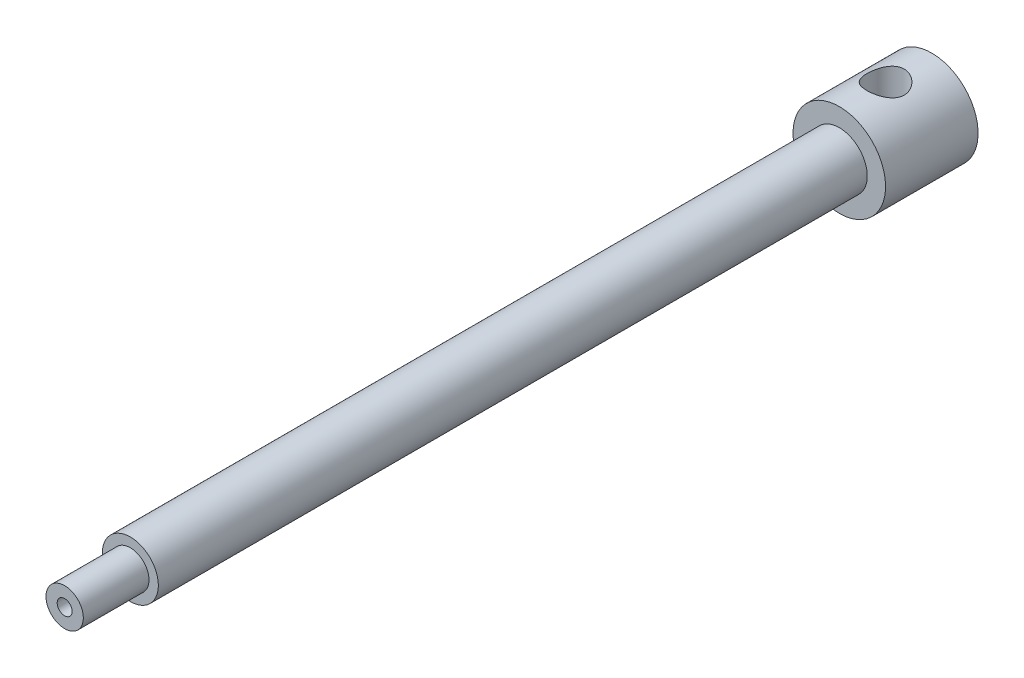
ISO-10303-21;
HEADER;
FILE_DESCRIPTION(('STEP AP214'),'2;1');
FILE_NAME('part.step','',(''),(''),'','','');
FILE_SCHEMA(('AUTOMOTIVE_DESIGN { 1 0 10303 214 1 1 1 1 }'));
ENDSEC;
DATA;
#1=APPLICATION_CONTEXT('core data for automotive mechanical design processes');
#2=APPLICATION_PROTOCOL_DEFINITION('international standard','automotive_design',2000,#1);
#3=PRODUCT_CONTEXT('',#1,'mechanical');
#4=PRODUCT('Part','Part','',(#3));
#5=PRODUCT_RELATED_PRODUCT_CATEGORY('part','',(#4));
#6=PRODUCT_DEFINITION_FORMATION('','',#4);
#7=PRODUCT_DEFINITION_CONTEXT('part definition',#1,'design');
#8=PRODUCT_DEFINITION('design','',#6,#7);
#9=PRODUCT_DEFINITION_SHAPE('','',#8);
#10=(LENGTH_UNIT() NAMED_UNIT(*) SI_UNIT(.MILLI.,.METRE.));
#11=(NAMED_UNIT(*) PLANE_ANGLE_UNIT() SI_UNIT($,.RADIAN.));
#12=(NAMED_UNIT(*) SI_UNIT($,.STERADIAN.) SOLID_ANGLE_UNIT());
#13=UNCERTAINTY_MEASURE_WITH_UNIT(LENGTH_MEASURE(1.E-05),#10,'distance_accuracy_value','');
#14=(GEOMETRIC_REPRESENTATION_CONTEXT(3) GLOBAL_UNCERTAINTY_ASSIGNED_CONTEXT((#13)) GLOBAL_UNIT_ASSIGNED_CONTEXT((#10,
#11,#12)) REPRESENTATION_CONTEXT('',''));
#15=CARTESIAN_POINT('',(0.,0.,0.));
#16=DIRECTION('',(0.,0.,1.));
#17=DIRECTION('',(1.,0.,0.));
#18=AXIS2_PLACEMENT_3D('',#15,#16,#17);
#19=CARTESIAN_POINT('',(0.,0.,-81.2702478184991));
#20=DIRECTION('',(0.,0.,-1.));
#21=DIRECTION('',(-1.,0.,0.));
#22=AXIS2_PLACEMENT_3D('',#19,#20,#21);
#23=PLANE('',#22);
#24=CARTESIAN_POINT('',(0.,0.,-81.2702478184991));
#25=DIRECTION('',(0.,0.,-1.));
#26=DIRECTION('',(-1.,0.,0.));
#27=AXIS2_PLACEMENT_3D('',#24,#25,#26);
#28=CIRCLE('',#27,7.874);
#29=CARTESIAN_POINT('',(-7.874,0.,-81.2702478184991));
#30=VERTEX_POINT('',#29);
#31=EDGE_CURVE('E46',#30,#30,#28,.T.);
#32=ORIENTED_EDGE('',*,*,#31,.T.);
#33=EDGE_LOOP('',(#32));
#34=FACE_BOUND('',#33,.T.);
#35=ADVANCED_FACE('F33',(#34),#23,.T.);
#36=CARTESIAN_POINT('',(0.,0.,-59.3109947643979));
#37=DIRECTION('',(0.,0.,-1.));
#38=DIRECTION('',(-1.,0.,0.));
#39=AXIS2_PLACEMENT_3D('',#36,#37,#38);
#40=CYLINDRICAL_SURFACE('',#39,7.874);
#41=CARTESIAN_POINT('',(0.,-7.874,-70.2212478184991));
#42=CARTESIAN_POINT('',(-0.0853138065275081,-7.87399881940996,-70.2212495287538));
#43=CARTESIAN_POINT('',(-0.170655569118883,-7.87260816109943,-70.2246933813816));
#44=CARTESIAN_POINT('',(-0.340713654830116,-7.8670870568026,-70.238426177336));
#45=CARTESIAN_POINT('',(-0.425429557306199,-7.86295491243566,-70.2487193639116));
#46=CARTESIAN_POINT('',(-0.678039818847449,-7.84656037982232,-70.289810548876));
#47=CARTESIAN_POINT('',(-0.844145904456292,-7.8303003155091,-70.3308198494403));
#48=CARTESIAN_POINT('',(-1.16597633099032,-7.78888379341851,-70.4382292266118));
#49=CARTESIAN_POINT('',(-1.32173292526666,-7.76375667937359,-70.504545612686));
#50=CARTESIAN_POINT('',(-1.61980477112045,-7.70708234066068,-70.6603523141924));
#51=CARTESIAN_POINT('',(-1.76212455210029,-7.67553729080246,-70.749834782256));
#52=CARTESIAN_POINT('',(-2.03623294066059,-7.60752595910327,-70.9539445050457));
#53=CARTESIAN_POINT('',(-2.16729406416504,-7.57090528781625,-71.0694962904209));
#54=CARTESIAN_POINT('',(-2.40879713559216,-7.49756820349839,-71.3205126235591));
#55=CARTESIAN_POINT('',(-2.51922885234361,-7.46085175206969,-71.455986992733));
#56=CARTESIAN_POINT('',(-2.72127432337628,-7.38962484616999,-71.7504679452352));
#57=CARTESIAN_POINT('',(-2.81180642099635,-7.35529016554302,-71.9102635413601));
#58=CARTESIAN_POINT('',(-2.96438328075604,-7.29514110783972,-72.2444048519625));
#59=CARTESIAN_POINT('',(-3.02644179233511,-7.26932262012663,-72.4187434956674));
#60=CARTESIAN_POINT('',(-3.11735731028281,-7.23078908211499,-72.7686647558273));
#61=CARTESIAN_POINT('',(-3.14760766678057,-7.21752692150469,-72.9438228836375));
#62=CARTESIAN_POINT('',(-3.17839972786044,-7.20402411896809,-73.2971924925769));
#63=CARTESIAN_POINT('',(-3.17895636979412,-7.20377692989252,-73.4754023933838));
#64=CARTESIAN_POINT('',(-3.15139986911577,-7.21586598122804,-73.8163357493213));
#65=CARTESIAN_POINT('',(-3.12531734809012,-7.22731097779205,-73.979261115535));
#66=CARTESIAN_POINT('',(-3.04861261148163,-7.2599970139528,-74.298188681552));
#67=CARTESIAN_POINT('',(-2.99798603661225,-7.28123979370803,-74.4541896461329));
#68=CARTESIAN_POINT('',(-2.87266148125854,-7.33159711138427,-74.7586385133537));
#69=CARTESIAN_POINT('',(-2.7974894289216,-7.36086469262606,-74.9068648227467));
#70=CARTESIAN_POINT('',(-2.62554103256057,-7.42393306054218,-75.1891502451631));
#71=CARTESIAN_POINT('',(-2.52875649293859,-7.45773556494299,-75.3232039553541));
#72=CARTESIAN_POINT('',(-2.30738329559368,-7.52930314782267,-75.5844366951323));
#73=CARTESIAN_POINT('',(-2.18120631669873,-7.56717076283725,-75.7102453111648));
#74=CARTESIAN_POINT('',(-1.90914693107844,-7.6403442972344,-75.9393595803243));
#75=CARTESIAN_POINT('',(-1.76326048229995,-7.67564968886261,-76.042660606171));
#76=CARTESIAN_POINT('',(-1.4519834597174,-7.74063128710988,-76.2256654507216));
#77=CARTESIAN_POINT('',(-1.28625612038942,-7.770178177633,-76.3048457305642));
#78=CARTESIAN_POINT('',(-0.942339676136122,-7.81933319563992,-76.4337293559055));
#79=CARTESIAN_POINT('',(-0.764157061091356,-7.83894645580241,-76.4834479264482));
#80=CARTESIAN_POINT('',(-0.411868434997358,-7.86508441274245,-76.5492068260554));
#81=CARTESIAN_POINT('',(-0.238158955914311,-7.87232361132224,-76.5670883354528));
#82=CARTESIAN_POINT('',(0.109913125954057,-7.8751541874265,-76.5741121314587));
#83=CARTESIAN_POINT('',(0.284275543869659,-7.87074864475774,-76.5632620170193));
#84=CARTESIAN_POINT('',(0.620305944604803,-7.85125168274721,-76.5144777216207));
#85=CARTESIAN_POINT('',(0.782189526574389,-7.83665910845881,-76.4778072332827));
#86=CARTESIAN_POINT('',(1.09735153985033,-7.79877594743778,-76.3801500829902));
#87=CARTESIAN_POINT('',(1.2506288659423,-7.77548424648976,-76.3191603060661));
#88=CARTESIAN_POINT('',(1.54952526280039,-7.7215691192632,-76.1726039404382));
#89=CARTESIAN_POINT('',(1.69476474747819,-7.69074255592152,-76.0863403071919));
#90=CARTESIAN_POINT('',(1.9692191024373,-7.62508998345414,-75.892456744738));
#91=CARTESIAN_POINT('',(2.09842745965652,-7.59026235978888,-75.7848281813421));
#92=CARTESIAN_POINT('',(2.34624639570533,-7.51749887820835,-75.5428079942727));
#93=CARTESIAN_POINT('',(2.46356495844852,-7.47951121875179,-75.4071055294251));
#94=CARTESIAN_POINT('',(2.67409019313409,-7.40685850541485,-75.1172796482994));
#95=CARTESIAN_POINT('',(2.76729262031799,-7.37219403713503,-74.963152996091));
#96=CARTESIAN_POINT('',(2.92760488751249,-7.31002813647435,-74.6383719227938));
#97=CARTESIAN_POINT('',(2.99443010034691,-7.28260584447471,-74.4675607728362));
#98=CARTESIAN_POINT('',(3.09784166451536,-7.23923042543573,-74.1156679056194));
#99=CARTESIAN_POINT('',(3.1344508273425,-7.223268647511,-73.9345940467282));
#100=CARTESIAN_POINT('',(3.1741950512847,-7.20588570117556,-73.5815491315865));
#101=CARTESIAN_POINT('',(3.17957712065926,-7.20348878444623,-73.4098775828431));
#102=CARTESIAN_POINT('',(3.16263373946768,-7.21094375400632,-73.0681957130031));
#103=CARTESIAN_POINT('',(3.14031193750608,-7.22079402733906,-72.8981851761228));
#104=CARTESIAN_POINT('',(3.0704400285169,-7.25076670667075,-72.5717727484618));
#105=CARTESIAN_POINT('',(3.02395739930064,-7.27045320090325,-72.4150986413132));
#106=CARTESIAN_POINT('',(2.90808989717555,-7.31756650255749,-72.1117150053178));
#107=CARTESIAN_POINT('',(2.83869867713797,-7.34499545482417,-71.9650082516569));
#108=CARTESIAN_POINT('',(2.67435156286363,-7.40647236593437,-71.6764772647667));
#109=CARTESIAN_POINT('',(2.578149222479,-7.44081139200889,-71.5354261533528));
#110=CARTESIAN_POINT('',(2.36471003282482,-7.51136725763288,-71.2707626227931));
#111=CARTESIAN_POINT('',(2.24746665718648,-7.54758467732478,-71.1471556356607));
#112=CARTESIAN_POINT('',(1.9860512819155,-7.62070147481599,-70.9124810456077));
#113=CARTESIAN_POINT('',(1.84060885823373,-7.65748671307923,-70.8027892145443));
#114=CARTESIAN_POINT('',(1.53189158073066,-7.72515755582715,-70.6093030241123));
#115=CARTESIAN_POINT('',(1.36860852242477,-7.75604042785347,-70.5255206483019));
#116=CARTESIAN_POINT('',(1.11544104764093,-7.79505300718687,-70.4222662523901));
#117=CARTESIAN_POINT('',(1.03045664945645,-7.80676698725231,-70.391756836274));
#118=CARTESIAN_POINT('',(0.857919448827436,-7.82760347443312,-70.3380219405745));
#119=CARTESIAN_POINT('',(0.770367866333488,-7.83672719113316,-70.3147930606439));
#120=CARTESIAN_POINT('',(0.593592483724014,-7.85209418620097,-70.2759195916782));
#121=CARTESIAN_POINT('',(0.504373518171903,-7.85834475183656,-70.2602558098559));
#122=CARTESIAN_POINT('',(0.324807824619731,-7.86781060535872,-70.2366097304264));
#123=CARTESIAN_POINT('',(0.234461932692078,-7.87102802193401,-70.2286220455954));
#124=CARTESIAN_POINT('',(0.0959969096121474,-7.87356143505396,-70.2223356386442));
#125=CARTESIAN_POINT('',(0.0480028800985487,-7.87400066427375,-70.221246856203));
#126=CARTESIAN_POINT('',(0.,-7.874,-70.2212478184991));
#127=B_SPLINE_CURVE_WITH_KNOTS('',3,(#41,#42,#43,#44,#45,#46,#47,#48,#49,#50,#51,#52,#53,#54,
#55,#56,#57,#58,#59,#60,#61,#62,#63,#64,#65,#66,#67,#68,#69,#70,#71,#72,#73,#74,#75,#76,#77,#78,
#79,#80,#81,#82,#83,#84,#85,#86,#87,#88,#89,#90,#91,#92,#93,#94,#95,#96,#97,#98,#99,#100,#101,
#102,#103,#104,#105,#106,#107,#108,#109,#110,#111,#112,#113,#114,#115,#116,#117,#118,#119,#120,
#121,#122,#123,#124,#125,#126),.UNSPECIFIED.,.T.,.F.,(4,2,2,2,2,2,2,2,2,2,2,2,2,2,2,2,2,2,2,2,2,
2,2,2,2,2,2,2,2,2,2,2,2,2,2,2,2,2,2,2,2,2,4),(0.,0.255899731194883,0.511958143293914,
1.02481747902563,1.53599528385105,2.04700015638134,2.58023537841371,3.11373436083281,
3.67144871720276,4.22889347805397,4.76074855451207,5.29233608003111,5.78622044005093,
6.28019255137074,6.78433340628689,7.28866576036915,7.83267264572705,8.37679126682102,
8.93199359096604,9.48690875022953,10.0085395584562,10.5300324193213,11.0276319412519,
11.5252952193857,12.0382372063084,12.5513869115499,13.098953460348,13.6466163226326,
14.2000370531299,14.7530395975858,15.2657026583338,15.7782982084344,16.2699608120375,
16.7617597517652,17.2820024165533,17.8024067265347,18.3573331353433,18.9125158243838,
19.1853715807685,19.4580997103418,19.7301322410375,20.0019737146484,20.1459588984515),.UNSPECIFIED.);
#128=CARTESIAN_POINT('',(0.,-7.874,-70.2212478184991));
#129=VERTEX_POINT('',#128);
#130=EDGE_CURVE('E10',#129,#129,#127,.T.);
#131=ORIENTED_EDGE('',*,*,#130,.F.);
#132=EDGE_LOOP('',(#131));
#133=FACE_BOUND('',#132,.T.);
#134=CARTESIAN_POINT('',(0.,7.874,-70.2212478184991));
#135=CARTESIAN_POINT('',(0.0853138065275098,7.87399881940996,-70.2212495287538));
#136=CARTESIAN_POINT('',(0.170655569118885,7.87260816109943,-70.2246933813816));
#137=CARTESIAN_POINT('',(0.340713654830117,7.8670870568026,-70.238426177336));
#138=CARTESIAN_POINT('',(0.4254295573062,7.86295491243566,-70.2487193639116));
#139=CARTESIAN_POINT('',(0.678039818847451,7.84656037982232,-70.289810548876));
#140=CARTESIAN_POINT('',(0.844145904456293,7.8303003155091,-70.3308198494403));
#141=CARTESIAN_POINT('',(1.16597633099032,7.78888379341851,-70.4382292266118));
#142=CARTESIAN_POINT('',(1.32173292526667,7.76375667937359,-70.504545612686));
#143=CARTESIAN_POINT('',(1.61980477112045,7.70708234066068,-70.6603523141924));
#144=CARTESIAN_POINT('',(1.76212455210029,7.67553729080246,-70.749834782256));
#145=CARTESIAN_POINT('',(2.03623294066059,7.60752595910327,-70.9539445050457));
#146=CARTESIAN_POINT('',(2.16729406416504,7.57090528781625,-71.0694962904209));
#147=CARTESIAN_POINT('',(2.40879713559217,7.49756820349839,-71.3205126235591));
#148=CARTESIAN_POINT('',(2.51922885234361,7.46085175206969,-71.455986992733));
#149=CARTESIAN_POINT('',(2.72127432337628,7.38962484616999,-71.7504679452352));
#150=CARTESIAN_POINT('',(2.81180642099636,7.35529016554302,-71.9102635413601));
#151=CARTESIAN_POINT('',(2.96438328075605,7.29514110783972,-72.2444048519625));
#152=CARTESIAN_POINT('',(3.02644179233512,7.26932262012663,-72.4187434956674));
#153=CARTESIAN_POINT('',(3.11735731028281,7.23078908211499,-72.7686647558273));
#154=CARTESIAN_POINT('',(3.14760766678057,7.21752692150469,-72.9438228836375));
#155=CARTESIAN_POINT('',(3.17839972786044,7.20402411896809,-73.2971924925769));
#156=CARTESIAN_POINT('',(3.17895636979412,7.20377692989252,-73.4754023933838));
#157=CARTESIAN_POINT('',(3.15139986911577,7.21586598122804,-73.8163357493213));
#158=CARTESIAN_POINT('',(3.12531734809013,7.22731097779205,-73.979261115535));
#159=CARTESIAN_POINT('',(3.04861261148164,7.2599970139528,-74.298188681552));
#160=CARTESIAN_POINT('',(2.99798603661225,7.28123979370803,-74.4541896461329));
#161=CARTESIAN_POINT('',(2.87266148125854,7.33159711138427,-74.7586385133537));
#162=CARTESIAN_POINT('',(2.79748942892161,7.36086469262606,-74.9068648227467));
#163=CARTESIAN_POINT('',(2.62554103256057,7.42393306054218,-75.1891502451631));
#164=CARTESIAN_POINT('',(2.52875649293859,7.45773556494299,-75.3232039553541));
#165=CARTESIAN_POINT('',(2.30738329559368,7.52930314782267,-75.5844366951323));
#166=CARTESIAN_POINT('',(2.18120631669874,7.56717076283725,-75.7102453111648));
#167=CARTESIAN_POINT('',(1.90914693107844,7.6403442972344,-75.9393595803243));
#168=CARTESIAN_POINT('',(1.76326048229995,7.67564968886261,-76.042660606171));
#169=CARTESIAN_POINT('',(1.45198345971741,7.74063128710988,-76.2256654507216));
#170=CARTESIAN_POINT('',(1.28625612038942,7.770178177633,-76.3048457305642));
#171=CARTESIAN_POINT('',(0.942339676136126,7.81933319563992,-76.4337293559055));
#172=CARTESIAN_POINT('',(0.764157061091361,7.83894645580241,-76.4834479264482));
#173=CARTESIAN_POINT('',(0.411868434997364,7.86508441274245,-76.5492068260554));
#174=CARTESIAN_POINT('',(0.238158955914317,7.87232361132224,-76.5670883354528));
#175=CARTESIAN_POINT('',(-0.10991312595405,7.8751541874265,-76.5741121314587));
#176=CARTESIAN_POINT('',(-0.284275543869652,7.87074864475774,-76.5632620170193));
#177=CARTESIAN_POINT('',(-0.620305944604795,7.85125168274721,-76.5144777216206));
#178=CARTESIAN_POINT('',(-0.782189526574379,7.83665910845881,-76.4778072332827));
#179=CARTESIAN_POINT('',(-1.09735153985032,7.79877594743778,-76.3801500829902));
#180=CARTESIAN_POINT('',(-1.2506288659423,7.77548424648976,-76.3191603060661));
#181=CARTESIAN_POINT('',(-1.54952526280039,7.7215691192632,-76.1726039404382));
#182=CARTESIAN_POINT('',(-1.69476474747818,7.69074255592153,-76.0863403071919));
#183=CARTESIAN_POINT('',(-1.96921910243728,7.62508998345415,-75.892456744738));
#184=CARTESIAN_POINT('',(-2.09842745965651,7.59026235978888,-75.7848281813421));
#185=CARTESIAN_POINT('',(-2.34624639570532,7.51749887820836,-75.5428079942727));
#186=CARTESIAN_POINT('',(-2.46356495844851,7.47951121875179,-75.4071055294251));
#187=CARTESIAN_POINT('',(-2.67409019313408,7.40685850541486,-75.1172796482994));
#188=CARTESIAN_POINT('',(-2.76729262031798,7.37219403713504,-74.9631529960911));
#189=CARTESIAN_POINT('',(-2.92760488751249,7.31002813647436,-74.6383719227938));
#190=CARTESIAN_POINT('',(-2.99443010034691,7.28260584447471,-74.4675607728362));
#191=CARTESIAN_POINT('',(-3.09784166451536,7.23923042543573,-74.1156679056194));
#192=CARTESIAN_POINT('',(-3.1344508273425,7.223268647511,-73.9345940467282));
#193=CARTESIAN_POINT('',(-3.1741950512847,7.20588570117556,-73.5815491315865));
#194=CARTESIAN_POINT('',(-3.17957712065925,7.20348878444623,-73.4098775828431));
#195=CARTESIAN_POINT('',(-3.16263373946768,7.21094375400632,-73.0681957130031));
#196=CARTESIAN_POINT('',(-3.14031193750607,7.22079402733906,-72.8981851761228));
#197=CARTESIAN_POINT('',(-3.0704400285169,7.25076670667075,-72.5717727484618));
#198=CARTESIAN_POINT('',(-3.02395739930063,7.27045320090325,-72.4150986413132));
#199=CARTESIAN_POINT('',(-2.90808989717554,7.31756650255749,-72.1117150053178));
#200=CARTESIAN_POINT('',(-2.83869867713796,7.34499545482417,-71.9650082516569));
#201=CARTESIAN_POINT('',(-2.67435156286363,7.40647236593437,-71.6764772647667));
#202=CARTESIAN_POINT('',(-2.578149222479,7.44081139200889,-71.5354261533528));
#203=CARTESIAN_POINT('',(-2.36471003282482,7.51136725763288,-71.2707626227931));
#204=CARTESIAN_POINT('',(-2.24746665718648,7.54758467732478,-71.1471556356607));
#205=CARTESIAN_POINT('',(-1.98605128191549,7.62070147481599,-70.9124810456077));
#206=CARTESIAN_POINT('',(-1.84060885823372,7.65748671307923,-70.8027892145443));
#207=CARTESIAN_POINT('',(-1.53189158073065,7.72515755582715,-70.6093030241123));
#208=CARTESIAN_POINT('',(-1.36860852242476,7.75604042785347,-70.5255206483019));
#209=CARTESIAN_POINT('',(-1.11544104764093,7.79505300718687,-70.4222662523901));
#210=CARTESIAN_POINT('',(-1.03045664945645,7.80676698725231,-70.391756836274));
#211=CARTESIAN_POINT('',(-0.857919448827434,7.82760347443312,-70.3380219405745));
#212=CARTESIAN_POINT('',(-0.770367866333487,7.83672719113316,-70.3147930606439));
#213=CARTESIAN_POINT('',(-0.593592483724013,7.85209418620097,-70.2759195916782));
#214=CARTESIAN_POINT('',(-0.504373518171902,7.85834475183656,-70.2602558098559));
#215=CARTESIAN_POINT('',(-0.324807824619729,7.86781060535872,-70.2366097304264));
#216=CARTESIAN_POINT('',(-0.234461932692076,7.87102802193401,-70.2286220455954));
#217=CARTESIAN_POINT('',(-0.0959969096121457,7.87356143505396,-70.2223356386442));
#218=CARTESIAN_POINT('',(-0.048002880098547,7.87400066427375,-70.221246856203));
#219=CARTESIAN_POINT('',(0.,7.874,-70.2212478184991));
#220=B_SPLINE_CURVE_WITH_KNOTS('',3,(#134,#135,#136,#137,#138,#139,#140,#141,#142,#143,#144,
#145,#146,#147,#148,#149,#150,#151,#152,#153,#154,#155,#156,#157,#158,#159,#160,#161,#162,#163,
#164,#165,#166,#167,#168,#169,#170,#171,#172,#173,#174,#175,#176,#177,#178,#179,#180,#181,#182,
#183,#184,#185,#186,#187,#188,#189,#190,#191,#192,#193,#194,#195,#196,#197,#198,#199,#200,#201,
#202,#203,#204,#205,#206,#207,#208,#209,#210,#211,#212,#213,#214,#215,#216,#217,#218,#219),
.UNSPECIFIED.,.T.,.F.,(4,2,2,2,2,2,2,2,2,2,2,2,2,2,2,2,2,2,2,2,2,2,2,2,2,2,2,2,2,2,2,2,2,2,2,2,
2,2,2,2,2,2,4),(0.,0.255899731194883,0.511958143293914,1.02481747902563,1.53599528385105,
2.04700015638134,2.58023537841371,3.11373436083281,3.67144871720276,4.22889347805397,
4.76074855451207,5.29233608003111,5.78622044005093,6.28019255137074,6.78433340628689,
7.28866576036916,7.83267264572705,8.37679126682102,8.93199359096604,9.48690875022953,
10.0085395584562,10.5300324193213,11.0276319412519,11.5252952193857,12.0382372063084,
12.5513869115499,13.098953460348,13.6466163226326,14.2000370531299,14.7530395975858,
15.2657026583338,15.7782982084344,16.2699608120375,16.7617597517652,17.2820024165533,
17.8024067265347,18.3573331353433,18.9125158243838,19.1853715807685,19.4580997103418,
19.7301322410375,20.0019737146484,20.1459588984515),.UNSPECIFIED.);
#221=CARTESIAN_POINT('',(0.,7.874,-70.2212478184991));
#222=VERTEX_POINT('',#221);
#223=EDGE_CURVE('E42',#222,#222,#220,.T.);
#224=ORIENTED_EDGE('',*,*,#223,.F.);
#225=EDGE_LOOP('',(#224));
#226=FACE_BOUND('',#225,.T.);
#227=CARTESIAN_POINT('',(0.,0.,-65.5222478184991));
#228=DIRECTION('',(0.,0.,-1.));
#229=DIRECTION('',(-1.,0.,0.));
#230=AXIS2_PLACEMENT_3D('',#227,#228,#229);
#231=CIRCLE('',#230,7.874);
#232=CARTESIAN_POINT('',(-7.874,0.,-65.5222478184991));
#233=VERTEX_POINT('',#232);
#234=EDGE_CURVE('E50',#233,#233,#231,.T.);
#235=ORIENTED_EDGE('',*,*,#234,.T.);
#236=EDGE_LOOP('',(#235));
#237=FACE_BOUND('',#236,.T.);
#238=ORIENTED_EDGE('',*,*,#31,.F.);
#239=EDGE_LOOP('',(#238));
#240=FACE_BOUND('',#239,.T.);
#241=ADVANCED_FACE('F55',(#133,#226,#237,#240),#40,.T.);
#242=CARTESIAN_POINT('',(-7.874,0.,-65.5222478184991));
#243=DIRECTION('',(0.,0.,1.));
#244=DIRECTION('',(1.,0.,0.));
#245=AXIS2_PLACEMENT_3D('',#242,#243,#244);
#246=PLANE('',#245);
#247=CARTESIAN_POINT('',(0.,0.,-65.5222478184991));
#248=DIRECTION('',(0.,0.,-1.));
#249=DIRECTION('',(-1.,0.,0.));
#250=AXIS2_PLACEMENT_3D('',#247,#248,#249);
#251=CIRCLE('',#250,4.7625);
#252=CARTESIAN_POINT('',(-4.7625,0.,-65.5222478184991));
#253=VERTEX_POINT('',#252);
#254=EDGE_CURVE('E160',#253,#253,#251,.T.);
#255=ORIENTED_EDGE('',*,*,#254,.T.);
#256=EDGE_LOOP('',(#255));
#257=FACE_BOUND('',#256,.T.);
#258=ORIENTED_EDGE('',*,*,#234,.F.);
#259=EDGE_LOOP('',(#258));
#260=FACE_BOUND('',#259,.T.);
#261=ADVANCED_FACE('F85',(#257,#260),#246,.T.);
#262=CARTESIAN_POINT('',(0.,0.,-59.3109947643979));
#263=DIRECTION('',(0.,0.,-1.));
#264=DIRECTION('',(-1.,0.,0.));
#265=AXIS2_PLACEMENT_3D('',#262,#263,#264);
#266=CYLINDRICAL_SURFACE('',#265,4.76249999999999);
#267=CARTESIAN_POINT('',(0.,0.,55.1277521815009));
#268=DIRECTION('',(0.,0.,-1.));
#269=DIRECTION('',(-1.,0.,0.));
#270=AXIS2_PLACEMENT_3D('',#267,#268,#269);
#271=CIRCLE('',#270,4.76249999999999);
#272=CARTESIAN_POINT('',(-4.76249999999999,0.,55.1277521815009));
#273=VERTEX_POINT('',#272);
#274=EDGE_CURVE('E164',#273,#273,#271,.T.);
#275=ORIENTED_EDGE('',*,*,#274,.T.);
#276=EDGE_LOOP('',(#275));
#277=FACE_BOUND('',#276,.T.);
#278=ORIENTED_EDGE('',*,*,#254,.F.);
#279=EDGE_LOOP('',(#278));
#280=FACE_BOUND('',#279,.T.);
#281=ADVANCED_FACE('F82',(#277,#280),#266,.T.);
#282=CARTESIAN_POINT('',(-4.76249999999999,0.,55.1277521815009));
#283=DIRECTION('',(0.,0.,1.));
#284=DIRECTION('',(1.,0.,0.));
#285=AXIS2_PLACEMENT_3D('',#282,#283,#284);
#286=PLANE('',#285);
#287=CARTESIAN_POINT('',(0.,0.,55.1277521815009));
#288=DIRECTION('',(0.,0.,-1.));
#289=DIRECTION('',(-1.,0.,0.));
#290=AXIS2_PLACEMENT_3D('',#287,#288,#289);
#291=CIRCLE('',#290,3.17499999999999);
#292=CARTESIAN_POINT('',(-3.17499999999999,0.,55.1277521815009));
#293=VERTEX_POINT('',#292);
#294=EDGE_CURVE('E169',#293,#293,#291,.T.);
#295=ORIENTED_EDGE('',*,*,#294,.T.);
#296=EDGE_LOOP('',(#295));
#297=FACE_BOUND('',#296,.T.);
#298=ORIENTED_EDGE('',*,*,#274,.F.);
#299=EDGE_LOOP('',(#298));
#300=FACE_BOUND('',#299,.T.);
#301=ADVANCED_FACE('F78',(#297,#300),#286,.T.);
#302=CARTESIAN_POINT('',(0.,0.,-59.3109947643979));
#303=DIRECTION('',(0.,0.,-1.));
#304=DIRECTION('',(-1.,0.,0.));
#305=AXIS2_PLACEMENT_3D('',#302,#303,#304);
#306=CYLINDRICAL_SURFACE('',#305,3.17499999999999);
#307=CARTESIAN_POINT('',(0.,0.,66.3037521815009));
#308=DIRECTION('',(0.,0.,-1.));
#309=DIRECTION('',(-1.,0.,0.));
#310=AXIS2_PLACEMENT_3D('',#307,#308,#309);
#311=CIRCLE('',#310,3.17499999999998);
#312=CARTESIAN_POINT('',(-3.17499999999998,0.,66.3037521815009));
#313=VERTEX_POINT('',#312);
#314=EDGE_CURVE('E172',#313,#313,#311,.T.);
#315=ORIENTED_EDGE('',*,*,#314,.T.);
#316=EDGE_LOOP('',(#315));
#317=FACE_BOUND('',#316,.T.);
#318=ORIENTED_EDGE('',*,*,#294,.F.);
#319=EDGE_LOOP('',(#318));
#320=FACE_BOUND('',#319,.T.);
#321=ADVANCED_FACE('F74',(#317,#320),#306,.T.);
#322=CARTESIAN_POINT('',(-3.17499999999998,0.,66.3037521815009));
#323=DIRECTION('',(0.,0.,1.));
#324=DIRECTION('',(1.,0.,0.));
#325=AXIS2_PLACEMENT_3D('',#322,#323,#324);
#326=PLANE('',#325);
#327=CARTESIAN_POINT('',(0.,0.,66.3037521815009));
#328=DIRECTION('',(0.,0.,-1.));
#329=DIRECTION('',(-1.,0.,0.));
#330=AXIS2_PLACEMENT_3D('',#327,#328,#329);
#331=CIRCLE('',#330,1.26999999999997);
#332=CARTESIAN_POINT('',(-1.26999999999997,0.,66.3037521815009));
#333=VERTEX_POINT('',#332);
#334=EDGE_CURVE('E175',#333,#333,#331,.T.);
#335=ORIENTED_EDGE('',*,*,#334,.T.);
#336=EDGE_LOOP('',(#335));
#337=FACE_BOUND('',#336,.T.);
#338=ORIENTED_EDGE('',*,*,#314,.F.);
#339=EDGE_LOOP('',(#338));
#340=FACE_BOUND('',#339,.T.);
#341=ADVANCED_FACE('F70',(#337,#340),#326,.T.);
#342=CARTESIAN_POINT('',(0.,0.,-59.3109947643979));
#343=DIRECTION('',(0.,0.,-1.));
#344=DIRECTION('',(-1.,0.,0.));
#345=AXIS2_PLACEMENT_3D('',#342,#343,#344);
#346=CYLINDRICAL_SURFACE('',#345,1.26999999999997);
#347=CARTESIAN_POINT('',(0.,0.,57.9420624155762));
#348=DIRECTION('',(0.,0.,-1.));
#349=DIRECTION('',(-1.,0.,0.));
#350=AXIS2_PLACEMENT_3D('',#347,#348,#349);
#351=CIRCLE('',#350,1.26999999999997);
#352=CARTESIAN_POINT('',(-1.26999999999997,0.,57.9420624155762));
#353=VERTEX_POINT('',#352);
#354=EDGE_CURVE('E178',#353,#353,#351,.T.);
#355=ORIENTED_EDGE('',*,*,#354,.T.);
#356=EDGE_LOOP('',(#355));
#357=FACE_BOUND('',#356,.T.);
#358=ORIENTED_EDGE('',*,*,#334,.F.);
#359=EDGE_LOOP('',(#358));
#360=FACE_BOUND('',#359,.T.);
#361=ADVANCED_FACE('F66',(#357,#360),#346,.F.);
#362=CARTESIAN_POINT('',(-1.26999999999997,0.,57.9420624155762));
#363=DIRECTION('',(0.,0.,1.));
#364=DIRECTION('',(1.,0.,0.));
#365=AXIS2_PLACEMENT_3D('',#362,#363,#364);
#366=PLANE('',#365);
#367=ORIENTED_EDGE('',*,*,#354,.F.);
#368=EDGE_LOOP('',(#367));
#369=FACE_BOUND('',#368,.T.);
#370=ADVANCED_FACE('F62',(#369),#366,.T.);
#371=CARTESIAN_POINT('',(0.,-7.874,-73.3962478184991));
#372=DIRECTION('',(0.,1.,0.));
#373=DIRECTION('',(0.,0.,1.));
#374=AXIS2_PLACEMENT_3D('',#371,#372,#373);
#375=CYLINDRICAL_SURFACE('',#374,3.175);
#376=ORIENTED_EDGE('',*,*,#130,.T.);
#377=EDGE_LOOP('',(#376));
#378=FACE_BOUND('',#377,.T.);
#379=ORIENTED_EDGE('',*,*,#223,.T.);
#380=EDGE_LOOP('',(#379));
#381=FACE_BOUND('',#380,.T.);
#382=ADVANCED_FACE('F58',(#378,#381),#375,.F.);
#383=CLOSED_SHELL('',(#35,#241,#261,#281,#301,#321,#341,#361,#370,#382));
#384=MANIFOLD_SOLID_BREP('B2',#383);
#385=ADVANCED_BREP_SHAPE_REPRESENTATION('',(#18,#384),#14);
#386=SHAPE_DEFINITION_REPRESENTATION(#9,#385);
ENDSEC;
END-ISO-10303-21;
